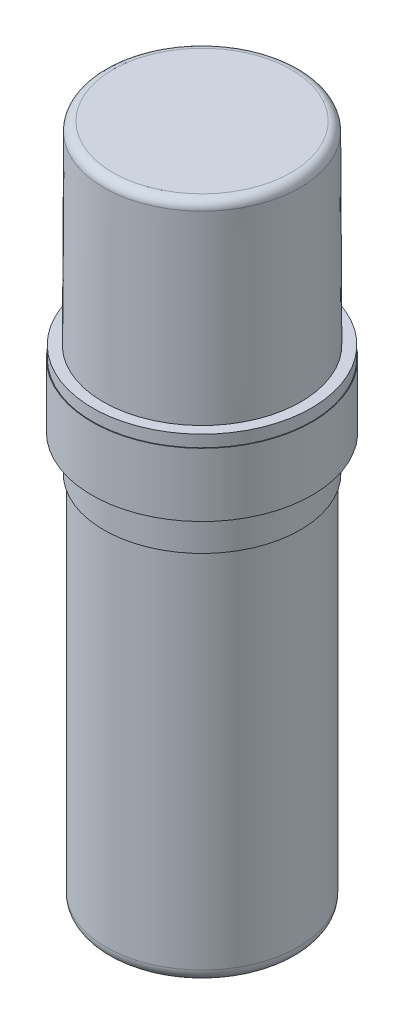
ISO-10303-21;
HEADER;
FILE_DESCRIPTION(('STEP AP214'),'2;1');
FILE_NAME('part.step','',(''),(''),'','','');
FILE_SCHEMA(('AUTOMOTIVE_DESIGN { 1 0 10303 214 1 1 1 1 }'));
ENDSEC;
DATA;
#1=APPLICATION_CONTEXT('core data for automotive mechanical design processes');
#2=APPLICATION_PROTOCOL_DEFINITION('international standard','automotive_design',2000,#1);
#3=PRODUCT_CONTEXT('',#1,'mechanical');
#4=PRODUCT('Part','Part','',(#3));
#5=PRODUCT_RELATED_PRODUCT_CATEGORY('part','',(#4));
#6=PRODUCT_DEFINITION_FORMATION('','',#4);
#7=PRODUCT_DEFINITION_CONTEXT('part definition',#1,'design');
#8=PRODUCT_DEFINITION('design','',#6,#7);
#9=PRODUCT_DEFINITION_SHAPE('','',#8);
#10=(LENGTH_UNIT() NAMED_UNIT(*) SI_UNIT(.MILLI.,.METRE.));
#11=(NAMED_UNIT(*) PLANE_ANGLE_UNIT() SI_UNIT($,.RADIAN.));
#12=(NAMED_UNIT(*) SI_UNIT($,.STERADIAN.) SOLID_ANGLE_UNIT());
#13=UNCERTAINTY_MEASURE_WITH_UNIT(LENGTH_MEASURE(1.E-05),#10,'distance_accuracy_value','');
#14=(GEOMETRIC_REPRESENTATION_CONTEXT(3) GLOBAL_UNCERTAINTY_ASSIGNED_CONTEXT((#13)) GLOBAL_UNIT_ASSIGNED_CONTEXT((#10,
#11,#12)) REPRESENTATION_CONTEXT('',''));
#15=CARTESIAN_POINT('',(0.,0.,0.));
#16=DIRECTION('',(0.,0.,1.));
#17=DIRECTION('',(1.,0.,0.));
#18=AXIS2_PLACEMENT_3D('',#15,#16,#17);
#19=CARTESIAN_POINT('',(0.,0.,0.));
#20=DIRECTION('',(0.,-1.,0.));
#21=DIRECTION('',(0.,0.,-1.));
#22=AXIS2_PLACEMENT_3D('',#19,#20,#21);
#23=PLANE('',#22);
#24=CARTESIAN_POINT('',(0.,0.,0.));
#25=DIRECTION('',(0.,-1.,0.));
#26=DIRECTION('',(0.,0.,-1.));
#27=AXIS2_PLACEMENT_3D('',#24,#25,#26);
#28=CIRCLE('',#27,18.75);
#29=CARTESIAN_POINT('',(0.,0.,-18.75));
#30=VERTEX_POINT('',#29);
#31=EDGE_CURVE('E38',#30,#30,#28,.T.);
#32=ORIENTED_EDGE('',*,*,#31,.T.);
#33=EDGE_LOOP('',(#32));
#34=FACE_BOUND('',#33,.T.);
#35=ADVANCED_FACE('F31',(#34),#23,.T.);
#36=CARTESIAN_POINT('',(0.,0.,0.));
#37=DIRECTION('',(0.,-1.,0.));
#38=DIRECTION('',(0.,0.,-1.));
#39=AXIS2_PLACEMENT_3D('',#36,#37,#38);
#40=CYLINDRICAL_SURFACE('',#39,21.75);
#41=CARTESIAN_POINT('',(0.,3.,0.));
#42=DIRECTION('',(0.,-1.,0.));
#43=DIRECTION('',(0.,0.,-1.));
#44=AXIS2_PLACEMENT_3D('',#41,#42,#43);
#45=CIRCLE('',#44,21.75);
#46=CARTESIAN_POINT('',(0.,3.,-21.75));
#47=VERTEX_POINT('',#46);
#48=EDGE_CURVE('E10',#47,#47,#45,.F.);
#49=ORIENTED_EDGE('',*,*,#48,.T.);
#50=EDGE_LOOP('',(#49));
#51=FACE_BOUND('',#50,.T.);
#52=CARTESIAN_POINT('',(0.,85.09,0.));
#53=DIRECTION('',(0.,-1.,0.));
#54=DIRECTION('',(0.,0.,-1.));
#55=AXIS2_PLACEMENT_3D('',#52,#53,#54);
#56=CIRCLE('',#55,21.75);
#57=CARTESIAN_POINT('',(0.,85.09,-21.75));
#58=VERTEX_POINT('',#57);
#59=EDGE_CURVE('E51',#58,#58,#56,.T.);
#60=ORIENTED_EDGE('',*,*,#59,.T.);
#61=EDGE_LOOP('',(#60));
#62=FACE_BOUND('',#61,.T.);
#63=ADVANCED_FACE('F94',(#51,#62),#40,.T.);
#64=CARTESIAN_POINT('',(21.75,85.09,0.));
#65=DIRECTION('',(0.,-1.,0.));
#66=DIRECTION('',(0.,0.,-1.));
#67=AXIS2_PLACEMENT_3D('',#64,#65,#66);
#68=PLANE('',#67);
#69=CARTESIAN_POINT('',(0.,85.09,0.));
#70=DIRECTION('',(0.,-1.,0.));
#71=DIRECTION('',(0.,0.,-1.));
#72=AXIS2_PLACEMENT_3D('',#69,#70,#71);
#73=CIRCLE('',#72,22.25);
#74=CARTESIAN_POINT('',(0.,85.09,-22.25));
#75=VERTEX_POINT('',#74);
#76=EDGE_CURVE('E54',#75,#75,#73,.T.);
#77=ORIENTED_EDGE('',*,*,#76,.T.);
#78=EDGE_LOOP('',(#77));
#79=FACE_BOUND('',#78,.T.);
#80=ORIENTED_EDGE('',*,*,#59,.F.);
#81=EDGE_LOOP('',(#80));
#82=FACE_BOUND('',#81,.T.);
#83=ADVANCED_FACE('F99',(#79,#82),#68,.T.);
#84=CARTESIAN_POINT('',(0.,0.,0.));
#85=DIRECTION('',(0.,-1.,0.));
#86=DIRECTION('',(0.,0.,-1.));
#87=AXIS2_PLACEMENT_3D('',#84,#85,#86);
#88=CYLINDRICAL_SURFACE('',#87,22.25);
#89=CARTESIAN_POINT('',(0.,93.26,0.));
#90=DIRECTION('',(0.,-1.,0.));
#91=DIRECTION('',(0.,0.,-1.));
#92=AXIS2_PLACEMENT_3D('',#89,#90,#91);
#93=CIRCLE('',#92,22.25);
#94=CARTESIAN_POINT('',(0.,93.26,-22.25));
#95=VERTEX_POINT('',#94);
#96=EDGE_CURVE('E57',#95,#95,#93,.T.);
#97=ORIENTED_EDGE('',*,*,#96,.T.);
#98=EDGE_LOOP('',(#97));
#99=FACE_BOUND('',#98,.T.);
#100=ORIENTED_EDGE('',*,*,#76,.F.);
#101=EDGE_LOOP('',(#100));
#102=FACE_BOUND('',#101,.T.);
#103=ADVANCED_FACE('F185',(#99,#102),#88,.T.);
#104=CARTESIAN_POINT('',(22.25,93.26,0.));
#105=DIRECTION('',(0.,-1.,0.));
#106=DIRECTION('',(0.,0.,-1.));
#107=AXIS2_PLACEMENT_3D('',#104,#105,#106);
#108=PLANE('',#107);
#109=CARTESIAN_POINT('',(0.,93.26,0.));
#110=DIRECTION('',(0.,-1.,0.));
#111=DIRECTION('',(0.,0.,-1.));
#112=AXIS2_PLACEMENT_3D('',#109,#110,#111);
#113=CIRCLE('',#112,24.95);
#114=CARTESIAN_POINT('',(0.,93.26,-24.95));
#115=VERTEX_POINT('',#114);
#116=EDGE_CURVE('E60',#115,#115,#113,.T.);
#117=ORIENTED_EDGE('',*,*,#116,.T.);
#118=EDGE_LOOP('',(#117));
#119=FACE_BOUND('',#118,.T.);
#120=ORIENTED_EDGE('',*,*,#96,.F.);
#121=EDGE_LOOP('',(#120));
#122=FACE_BOUND('',#121,.T.);
#123=ADVANCED_FACE('F175',(#119,#122),#108,.T.);
#124=CARTESIAN_POINT('',(0.,0.,0.));
#125=DIRECTION('',(0.,-1.,0.));
#126=DIRECTION('',(0.,0.,-1.));
#127=AXIS2_PLACEMENT_3D('',#124,#125,#126);
#128=CYLINDRICAL_SURFACE('',#127,24.95);
#129=CARTESIAN_POINT('',(0.,107.63,0.));
#130=DIRECTION('',(0.,-1.,0.));
#131=DIRECTION('',(0.,0.,-1.));
#132=AXIS2_PLACEMENT_3D('',#129,#130,#131);
#133=CIRCLE('',#132,24.95);
#134=CARTESIAN_POINT('',(0.,107.63,-24.95));
#135=VERTEX_POINT('',#134);
#136=EDGE_CURVE('E63',#135,#135,#133,.T.);
#137=ORIENTED_EDGE('',*,*,#136,.T.);
#138=EDGE_LOOP('',(#137));
#139=FACE_BOUND('',#138,.T.);
#140=ORIENTED_EDGE('',*,*,#116,.F.);
#141=EDGE_LOOP('',(#140));
#142=FACE_BOUND('',#141,.T.);
#143=ADVANCED_FACE('F165',(#139,#142),#128,.T.);
#144=CARTESIAN_POINT('',(24.95,107.63,0.));
#145=DIRECTION('',(0.,1.,0.));
#146=DIRECTION('',(0.,0.,1.));
#147=AXIS2_PLACEMENT_3D('',#144,#145,#146);
#148=PLANE('',#147);
#149=CARTESIAN_POINT('',(0.,107.63,0.));
#150=DIRECTION('',(0.,-1.,0.));
#151=DIRECTION('',(0.,0.,-1.));
#152=AXIS2_PLACEMENT_3D('',#149,#150,#151);
#153=CIRCLE('',#152,24.8);
#154=CARTESIAN_POINT('',(0.,107.63,-24.8));
#155=VERTEX_POINT('',#154);
#156=EDGE_CURVE('E66',#155,#155,#153,.T.);
#157=ORIENTED_EDGE('',*,*,#156,.T.);
#158=EDGE_LOOP('',(#157));
#159=FACE_BOUND('',#158,.T.);
#160=ORIENTED_EDGE('',*,*,#136,.F.);
#161=EDGE_LOOP('',(#160));
#162=FACE_BOUND('',#161,.T.);
#163=ADVANCED_FACE('F155',(#159,#162),#148,.T.);
#164=CARTESIAN_POINT('',(0.,0.,0.));
#165=DIRECTION('',(0.,-1.,0.));
#166=DIRECTION('',(0.,0.,-1.));
#167=AXIS2_PLACEMENT_3D('',#164,#165,#166);
#168=CYLINDRICAL_SURFACE('',#167,24.8);
#169=CARTESIAN_POINT('',(0.,110.3,0.));
#170=DIRECTION('',(0.,-1.,0.));
#171=DIRECTION('',(0.,0.,-1.));
#172=AXIS2_PLACEMENT_3D('',#169,#170,#171);
#173=CIRCLE('',#172,24.8);
#174=CARTESIAN_POINT('',(0.,110.3,-24.8));
#175=VERTEX_POINT('',#174);
#176=EDGE_CURVE('E69',#175,#175,#173,.T.);
#177=ORIENTED_EDGE('',*,*,#176,.T.);
#178=EDGE_LOOP('',(#177));
#179=FACE_BOUND('',#178,.T.);
#180=ORIENTED_EDGE('',*,*,#156,.F.);
#181=EDGE_LOOP('',(#180));
#182=FACE_BOUND('',#181,.T.);
#183=ADVANCED_FACE('F91',(#179,#182),#168,.T.);
#184=CARTESIAN_POINT('',(24.8,110.3,0.));
#185=DIRECTION('',(0.,1.,0.));
#186=DIRECTION('',(0.,0.,1.));
#187=AXIS2_PLACEMENT_3D('',#184,#185,#186);
#188=PLANE('',#187);
#189=CARTESIAN_POINT('',(0.,110.3,0.));
#190=DIRECTION('',(0.,-1.,0.));
#191=DIRECTION('',(0.,0.,-1.));
#192=AXIS2_PLACEMENT_3D('',#189,#190,#191);
#193=CIRCLE('',#192,22.4);
#194=CARTESIAN_POINT('',(0.,110.3,-22.4));
#195=VERTEX_POINT('',#194);
#196=EDGE_CURVE('E72',#195,#195,#193,.T.);
#197=ORIENTED_EDGE('',*,*,#196,.T.);
#198=EDGE_LOOP('',(#197));
#199=FACE_BOUND('',#198,.T.);
#200=ORIENTED_EDGE('',*,*,#176,.F.);
#201=EDGE_LOOP('',(#200));
#202=FACE_BOUND('',#201,.T.);
#203=ADVANCED_FACE('F76',(#199,#202),#188,.T.);
#204=CARTESIAN_POINT('',(0.,110.3,0.));
#205=DIRECTION('',(0.,-1.,0.));
#206=DIRECTION('',(0.,0.,-1.));
#207=AXIS2_PLACEMENT_3D('',#204,#205,#206);
#208=CONICAL_SURFACE('',#207,22.4,0.00455577713722998);
#209=CARTESIAN_POINT('',(0.,152.209111522756,0.));
#210=DIRECTION('',(0.,1.,0.));
#211=DIRECTION('',(0.,0.,1.));
#212=AXIS2_PLACEMENT_3D('',#209,#210,#211);
#213=CIRCLE('',#212,22.2090701069578);
#214=CARTESIAN_POINT('',(0.,152.209111522756,22.2090701069578));
#215=VERTEX_POINT('',#214);
#216=EDGE_CURVE('E46',#215,#215,#213,.F.);
#217=ORIENTED_EDGE('',*,*,#216,.T.);
#218=EDGE_LOOP('',(#217));
#219=FACE_BOUND('',#218,.T.);
#220=ORIENTED_EDGE('',*,*,#196,.F.);
#221=EDGE_LOOP('',(#220));
#222=FACE_BOUND('',#221,.T.);
#223=ADVANCED_FACE('F79',(#219,#222),#208,.T.);
#224=CARTESIAN_POINT('',(22.2,154.2,0.));
#225=DIRECTION('',(0.,1.,0.));
#226=DIRECTION('',(0.,0.,1.));
#227=AXIS2_PLACEMENT_3D('',#224,#225,#226);
#228=PLANE('',#227);
#229=CARTESIAN_POINT('',(0.,154.2,0.));
#230=DIRECTION('',(0.,1.,0.));
#231=DIRECTION('',(0.,0.,1.));
#232=AXIS2_PLACEMENT_3D('',#229,#230,#231);
#233=CIRCLE('',#232,20.2090908620273);
#234=CARTESIAN_POINT('',(0.,154.2,20.2090908620273));
#235=VERTEX_POINT('',#234);
#236=EDGE_CURVE('E42',#235,#235,#233,.T.);
#237=ORIENTED_EDGE('',*,*,#236,.T.);
#238=EDGE_LOOP('',(#237));
#239=FACE_BOUND('',#238,.T.);
#240=ADVANCED_FACE('F81',(#239),#228,.T.);
#241=CARTESIAN_POINT('',(0.,152.2,0.));
#242=DIRECTION('',(0.,1.,0.));
#243=DIRECTION('',(0.,0.,1.));
#244=AXIS2_PLACEMENT_3D('',#241,#242,#243);
#245=TOROIDAL_SURFACE('',#244,20.2090908620273,2.);
#246=ORIENTED_EDGE('',*,*,#236,.F.);
#247=EDGE_LOOP('',(#246));
#248=FACE_BOUND('',#247,.T.);
#249=ORIENTED_EDGE('',*,*,#216,.F.);
#250=EDGE_LOOP('',(#249));
#251=FACE_BOUND('',#250,.T.);
#252=ADVANCED_FACE('F88',(#248,#251),#245,.T.);
#253=CARTESIAN_POINT('',(0.,3.,0.));
#254=DIRECTION('',(0.,-1.,0.));
#255=DIRECTION('',(0.,0.,-1.));
#256=AXIS2_PLACEMENT_3D('',#253,#254,#255);
#257=TOROIDAL_SURFACE('',#256,18.75,3.);
#258=ORIENTED_EDGE('',*,*,#48,.F.);
#259=EDGE_LOOP('',(#258));
#260=FACE_BOUND('',#259,.T.);
#261=ORIENTED_EDGE('',*,*,#31,.F.);
#262=EDGE_LOOP('',(#261));
#263=FACE_BOUND('',#262,.T.);
#264=ADVANCED_FACE('F33',(#260,#263),#257,.T.);
#265=CLOSED_SHELL('',(#35,#63,#83,#103,#123,#143,#163,#183,#203,#223,#240,#252,#264));
#266=MANIFOLD_SOLID_BREP('B2',#265);
#267=ADVANCED_BREP_SHAPE_REPRESENTATION('',(#18,#266),#14);
#268=SHAPE_DEFINITION_REPRESENTATION(#9,#267);
ENDSEC;
END-ISO-10303-21;
